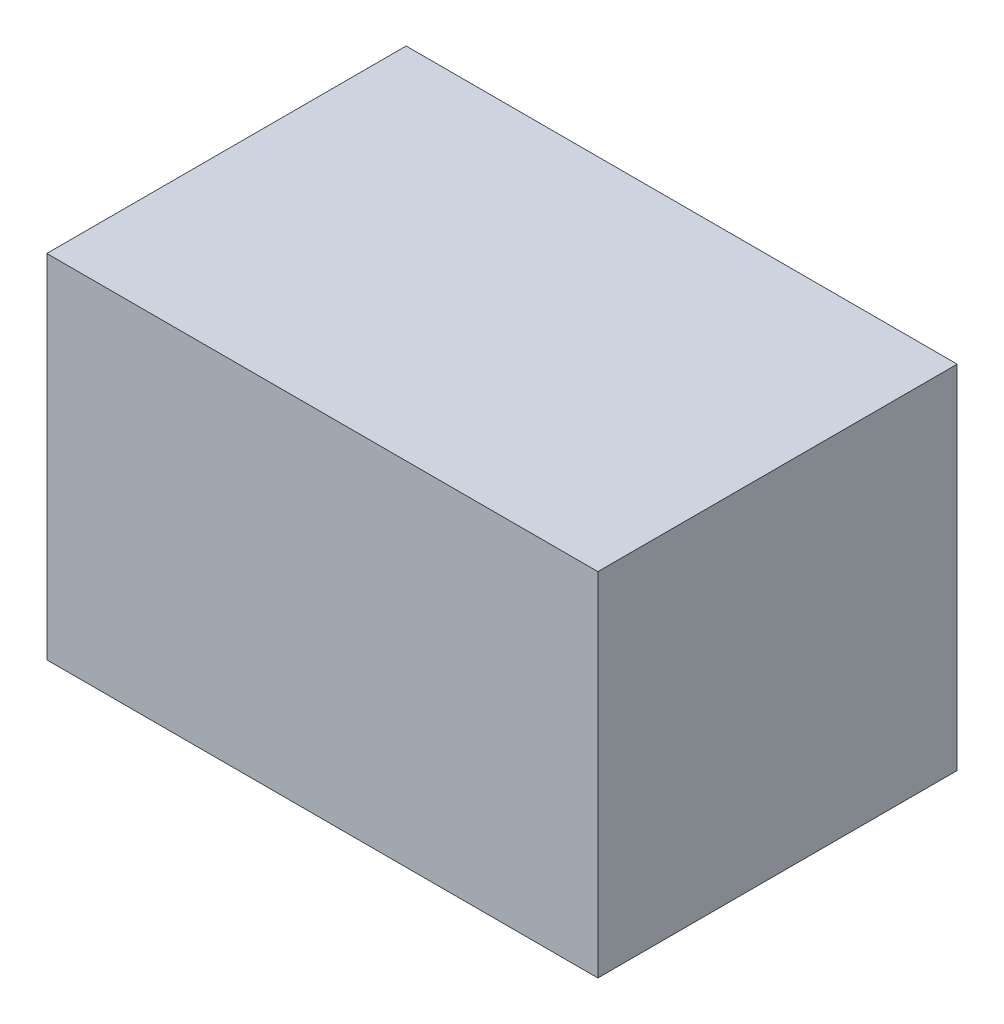
ISO-10303-21;
HEADER;
FILE_DESCRIPTION(('STEP AP214'),'2;1');
FILE_NAME('part.step','',(''),(''),'','','');
FILE_SCHEMA(('AUTOMOTIVE_DESIGN { 1 0 10303 214 1 1 1 1 }'));
ENDSEC;
DATA;
#1=APPLICATION_CONTEXT('core data for automotive mechanical design processes');
#2=APPLICATION_PROTOCOL_DEFINITION('international standard','automotive_design',2000,#1);
#3=PRODUCT_CONTEXT('',#1,'mechanical');
#4=PRODUCT('Part','Part','',(#3));
#5=PRODUCT_RELATED_PRODUCT_CATEGORY('part','',(#4));
#6=PRODUCT_DEFINITION_FORMATION('','',#4);
#7=PRODUCT_DEFINITION_CONTEXT('part definition',#1,'design');
#8=PRODUCT_DEFINITION('design','',#6,#7);
#9=PRODUCT_DEFINITION_SHAPE('','',#8);
#10=(LENGTH_UNIT() NAMED_UNIT(*) SI_UNIT(.MILLI.,.METRE.));
#11=(NAMED_UNIT(*) PLANE_ANGLE_UNIT() SI_UNIT($,.RADIAN.));
#12=(NAMED_UNIT(*) SI_UNIT($,.STERADIAN.) SOLID_ANGLE_UNIT());
#13=UNCERTAINTY_MEASURE_WITH_UNIT(LENGTH_MEASURE(1.E-05),#10,'distance_accuracy_value','');
#14=(GEOMETRIC_REPRESENTATION_CONTEXT(3) GLOBAL_UNCERTAINTY_ASSIGNED_CONTEXT((#13)) GLOBAL_UNIT_ASSIGNED_CONTEXT((#10,
#11,#12)) REPRESENTATION_CONTEXT('',''));
#15=CARTESIAN_POINT('',(0.,0.,0.));
#16=DIRECTION('',(0.,0.,1.));
#17=DIRECTION('',(1.,0.,0.));
#18=AXIS2_PLACEMENT_3D('',#15,#16,#17);
#19=CARTESIAN_POINT('',(75.565,96.52,-49.276));
#20=DIRECTION('',(-1.,0.,0.));
#21=DIRECTION('',(0.,0.,1.));
#22=AXIS2_PLACEMENT_3D('',#19,#20,#21);
#23=PLANE('',#22);
#24=DIRECTION('',(0.,0.,-1.));
#25=VECTOR('',#24,1.);
#26=CARTESIAN_POINT('',(75.565,0.,-49.276));
#27=LINE('',#26,#25);
#28=CARTESIAN_POINT('',(75.565,0.,49.276));
#29=VERTEX_POINT('',#28);
#30=CARTESIAN_POINT('',(75.565,0.,-49.276));
#31=VERTEX_POINT('',#30);
#32=EDGE_CURVE('E96',#29,#31,#27,.T.);
#33=ORIENTED_EDGE('',*,*,#32,.T.);
#34=DIRECTION('',(0.,-1.,0.));
#35=VECTOR('',#34,1.);
#36=CARTESIAN_POINT('',(75.565,96.52,-49.276));
#37=LINE('',#36,#35);
#38=CARTESIAN_POINT('',(75.565,96.52,-49.276));
#39=VERTEX_POINT('',#38);
#40=EDGE_CURVE('E11',#39,#31,#37,.T.);
#41=ORIENTED_EDGE('',*,*,#40,.F.);
#42=DIRECTION('',(0.,0.,-1.));
#43=VECTOR('',#42,1.);
#44=CARTESIAN_POINT('',(75.565,96.52,-49.276));
#45=LINE('',#44,#43);
#46=CARTESIAN_POINT('',(75.565,96.52,49.276));
#47=VERTEX_POINT('',#46);
#48=EDGE_CURVE('E84',#47,#39,#45,.T.);
#49=ORIENTED_EDGE('',*,*,#48,.F.);
#50=DIRECTION('',(0.,-1.,0.));
#51=VECTOR('',#50,1.);
#52=CARTESIAN_POINT('',(75.565,96.52,49.276));
#53=LINE('',#52,#51);
#54=EDGE_CURVE('E92',#47,#29,#53,.T.);
#55=ORIENTED_EDGE('',*,*,#54,.T.);
#56=EDGE_LOOP('',(#33,#41,#49,#55));
#57=FACE_BOUND('',#56,.T.);
#58=ADVANCED_FACE('F33',(#57),#23,.F.);
#59=CARTESIAN_POINT('',(-75.565,96.52,-49.276));
#60=DIRECTION('',(0.,0.,1.));
#61=DIRECTION('',(1.,0.,0.));
#62=AXIS2_PLACEMENT_3D('',#59,#60,#61);
#63=PLANE('',#62);
#64=DIRECTION('',(-1.,0.,0.));
#65=VECTOR('',#64,1.);
#66=CARTESIAN_POINT('',(-75.565,0.,-49.276));
#67=LINE('',#66,#65);
#68=CARTESIAN_POINT('',(-75.565,0.,-49.276));
#69=VERTEX_POINT('',#68);
#70=EDGE_CURVE('E88',#31,#69,#67,.T.);
#71=ORIENTED_EDGE('',*,*,#70,.T.);
#72=DIRECTION('',(0.,-1.,0.));
#73=VECTOR('',#72,1.);
#74=CARTESIAN_POINT('',(-75.565,96.52,-49.276));
#75=LINE('',#74,#73);
#76=CARTESIAN_POINT('',(-75.565,96.52,-49.276));
#77=VERTEX_POINT('',#76);
#78=EDGE_CURVE('E41',#77,#69,#75,.T.);
#79=ORIENTED_EDGE('',*,*,#78,.F.);
#80=DIRECTION('',(-1.,0.,0.));
#81=VECTOR('',#80,1.);
#82=CARTESIAN_POINT('',(-75.565,96.52,-49.276));
#83=LINE('',#82,#81);
#84=EDGE_CURVE('E79',#39,#77,#83,.T.);
#85=ORIENTED_EDGE('',*,*,#84,.F.);
#86=ORIENTED_EDGE('',*,*,#40,.T.);
#87=EDGE_LOOP('',(#71,#79,#85,#86));
#88=FACE_BOUND('',#87,.T.);
#89=ADVANCED_FACE('F87',(#88),#63,.F.);
#90=CARTESIAN_POINT('',(-75.565,96.52,-49.276));
#91=DIRECTION('',(1.,0.,0.));
#92=DIRECTION('',(0.,0.,-1.));
#93=AXIS2_PLACEMENT_3D('',#90,#91,#92);
#94=PLANE('',#93);
#95=DIRECTION('',(0.,0.,1.));
#96=VECTOR('',#95,1.);
#97=CARTESIAN_POINT('',(-75.565,0.,-49.276));
#98=LINE('',#97,#96);
#99=CARTESIAN_POINT('',(-75.565,0.,49.276));
#100=VERTEX_POINT('',#99);
#101=EDGE_CURVE('E66',#69,#100,#98,.T.);
#102=ORIENTED_EDGE('',*,*,#101,.T.);
#103=DIRECTION('',(0.,-1.,0.));
#104=VECTOR('',#103,1.);
#105=CARTESIAN_POINT('',(-75.565,96.52,49.276));
#106=LINE('',#105,#104);
#107=CARTESIAN_POINT('',(-75.565,96.52,49.276));
#108=VERTEX_POINT('',#107);
#109=EDGE_CURVE('E89',#108,#100,#106,.T.);
#110=ORIENTED_EDGE('',*,*,#109,.F.);
#111=DIRECTION('',(0.,0.,1.));
#112=VECTOR('',#111,1.);
#113=CARTESIAN_POINT('',(-75.565,96.52,-49.276));
#114=LINE('',#113,#112);
#115=EDGE_CURVE('E82',#77,#108,#114,.T.);
#116=ORIENTED_EDGE('',*,*,#115,.F.);
#117=ORIENTED_EDGE('',*,*,#78,.T.);
#118=EDGE_LOOP('',(#102,#110,#116,#117));
#119=FACE_BOUND('',#118,.T.);
#120=ADVANCED_FACE('F90',(#119),#94,.F.);
#121=CARTESIAN_POINT('',(-75.565,96.52,49.276));
#122=DIRECTION('',(0.,0.,-1.));
#123=DIRECTION('',(-1.,0.,0.));
#124=AXIS2_PLACEMENT_3D('',#121,#122,#123);
#125=PLANE('',#124);
#126=DIRECTION('',(1.,0.,0.));
#127=VECTOR('',#126,1.);
#128=CARTESIAN_POINT('',(-75.565,0.,49.276));
#129=LINE('',#128,#127);
#130=EDGE_CURVE('E72',#100,#29,#129,.T.);
#131=ORIENTED_EDGE('',*,*,#130,.T.);
#132=ORIENTED_EDGE('',*,*,#54,.F.);
#133=DIRECTION('',(1.,0.,0.));
#134=VECTOR('',#133,1.);
#135=CARTESIAN_POINT('',(-75.565,96.52,49.276));
#136=LINE('',#135,#134);
#137=EDGE_CURVE('E49',#108,#47,#136,.T.);
#138=ORIENTED_EDGE('',*,*,#137,.F.);
#139=ORIENTED_EDGE('',*,*,#109,.T.);
#140=EDGE_LOOP('',(#131,#132,#138,#139));
#141=FACE_BOUND('',#140,.T.);
#142=ADVANCED_FACE('F103',(#141),#125,.F.);
#143=CARTESIAN_POINT('',(0.,96.52,0.));
#144=DIRECTION('',(0.,1.,0.));
#145=DIRECTION('',(0.,0.,1.));
#146=AXIS2_PLACEMENT_3D('',#143,#144,#145);
#147=PLANE('',#146);
#148=ORIENTED_EDGE('',*,*,#48,.T.);
#149=ORIENTED_EDGE('',*,*,#84,.T.);
#150=ORIENTED_EDGE('',*,*,#115,.T.);
#151=ORIENTED_EDGE('',*,*,#137,.T.);
#152=EDGE_LOOP('',(#148,#149,#150,#151));
#153=FACE_BOUND('',#152,.T.);
#154=ADVANCED_FACE('F80',(#153),#147,.T.);
#155=CARTESIAN_POINT('',(0.,0.,0.));
#156=DIRECTION('',(0.,1.,0.));
#157=DIRECTION('',(0.,0.,1.));
#158=AXIS2_PLACEMENT_3D('',#155,#156,#157);
#159=PLANE('',#158);
#160=ORIENTED_EDGE('',*,*,#32,.F.);
#161=ORIENTED_EDGE('',*,*,#130,.F.);
#162=ORIENTED_EDGE('',*,*,#101,.F.);
#163=ORIENTED_EDGE('',*,*,#70,.F.);
#164=EDGE_LOOP('',(#160,#161,#162,#163));
#165=FACE_BOUND('',#164,.T.);
#166=ADVANCED_FACE('F106',(#165),#159,.F.);
#167=CLOSED_SHELL('',(#58,#89,#120,#142,#154,#166));
#168=MANIFOLD_SOLID_BREP('B2',#167);
#169=ADVANCED_BREP_SHAPE_REPRESENTATION('',(#18,#168),#14);
#170=SHAPE_DEFINITION_REPRESENTATION(#9,#169);
ENDSEC;
END-ISO-10303-21;
